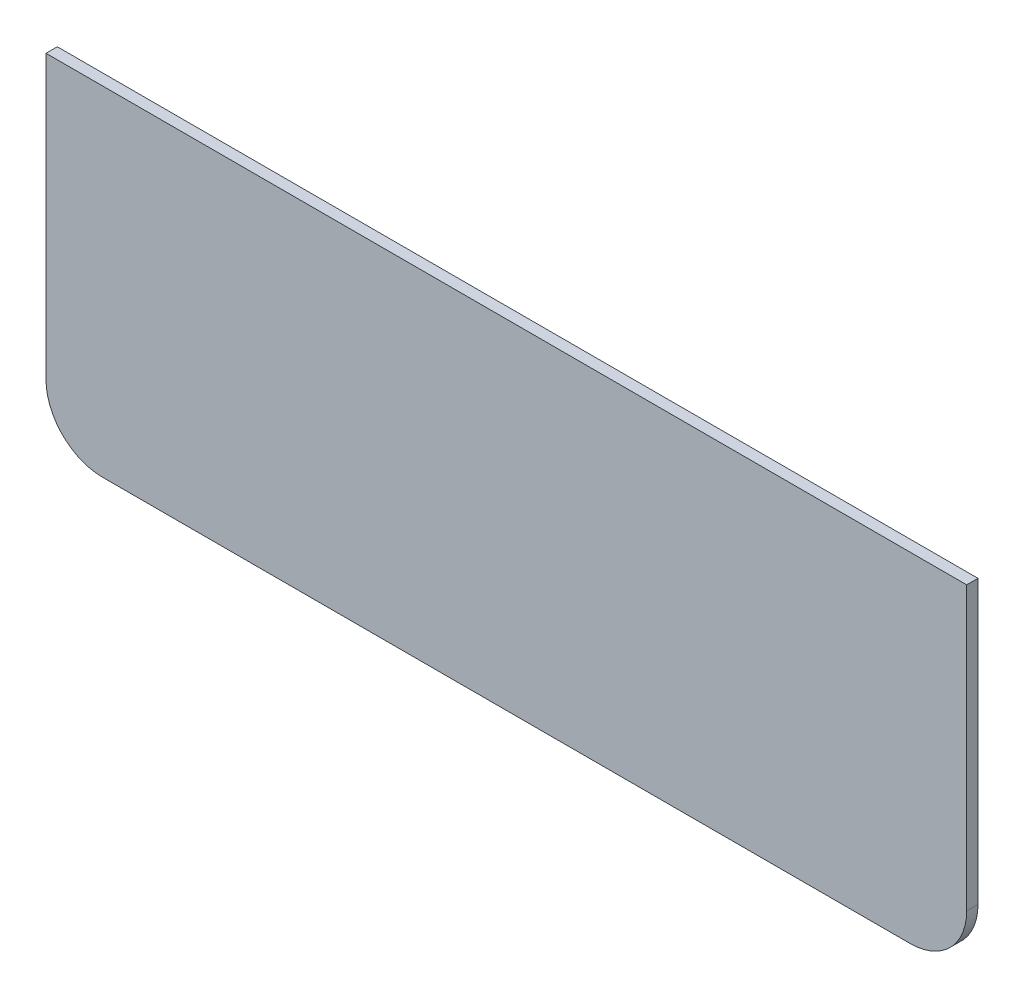
ISO-10303-21;
HEADER;
FILE_DESCRIPTION(('STEP AP214'),'2;1');
FILE_NAME('part.step','',(''),(''),'','','');
FILE_SCHEMA(('AUTOMOTIVE_DESIGN { 1 0 10303 214 1 1 1 1 }'));
ENDSEC;
DATA;
#1=APPLICATION_CONTEXT('core data for automotive mechanical design processes');
#2=APPLICATION_PROTOCOL_DEFINITION('international standard','automotive_design',2000,#1);
#3=PRODUCT_CONTEXT('',#1,'mechanical');
#4=PRODUCT('Part','Part','',(#3));
#5=PRODUCT_RELATED_PRODUCT_CATEGORY('part','',(#4));
#6=PRODUCT_DEFINITION_FORMATION('','',#4);
#7=PRODUCT_DEFINITION_CONTEXT('part definition',#1,'design');
#8=PRODUCT_DEFINITION('design','',#6,#7);
#9=PRODUCT_DEFINITION_SHAPE('','',#8);
#10=(LENGTH_UNIT() NAMED_UNIT(*) SI_UNIT(.MILLI.,.METRE.));
#11=(NAMED_UNIT(*) PLANE_ANGLE_UNIT() SI_UNIT($,.RADIAN.));
#12=(NAMED_UNIT(*) SI_UNIT($,.STERADIAN.) SOLID_ANGLE_UNIT());
#13=UNCERTAINTY_MEASURE_WITH_UNIT(LENGTH_MEASURE(1.E-05),#10,'distance_accuracy_value','');
#14=(GEOMETRIC_REPRESENTATION_CONTEXT(3) GLOBAL_UNCERTAINTY_ASSIGNED_CONTEXT((#13)) GLOBAL_UNIT_ASSIGNED_CONTEXT((#10,
#11,#12)) REPRESENTATION_CONTEXT('',''));
#15=CARTESIAN_POINT('',(0.,0.,0.));
#16=DIRECTION('',(0.,0.,1.));
#17=DIRECTION('',(1.,0.,0.));
#18=AXIS2_PLACEMENT_3D('',#15,#16,#17);
#19=CARTESIAN_POINT('',(81.5,-30.,2.));
#20=DIRECTION('',(-1.,0.,0.));
#21=DIRECTION('',(0.,0.,1.));
#22=AXIS2_PLACEMENT_3D('',#19,#20,#21);
#23=PLANE('',#22);
#24=DIRECTION('',(0.,1.,0.));
#25=VECTOR('',#24,1.);
#26=CARTESIAN_POINT('',(81.5,-30.,2.));
#27=LINE('',#26,#25);
#28=CARTESIAN_POINT('',(81.5,-20.,2.));
#29=VERTEX_POINT('',#28);
#30=CARTESIAN_POINT('',(81.5,30.,2.));
#31=VERTEX_POINT('',#30);
#32=EDGE_CURVE('E95',#29,#31,#27,.T.);
#33=ORIENTED_EDGE('',*,*,#32,.F.);
#34=DIRECTION('',(0.,0.,-1.));
#35=VECTOR('',#34,1.);
#36=CARTESIAN_POINT('',(81.5,-20.,2.));
#37=LINE('',#36,#35);
#38=CARTESIAN_POINT('',(81.5,-20.,0.));
#39=VERTEX_POINT('',#38);
#40=EDGE_CURVE('E118',#29,#39,#37,.T.);
#41=ORIENTED_EDGE('',*,*,#40,.T.);
#42=DIRECTION('',(0.,1.,0.));
#43=VECTOR('',#42,1.);
#44=CARTESIAN_POINT('',(81.5,-30.,0.));
#45=LINE('',#44,#43);
#46=CARTESIAN_POINT('',(81.5,30.,0.));
#47=VERTEX_POINT('',#46);
#48=EDGE_CURVE('E116',#39,#47,#45,.T.);
#49=ORIENTED_EDGE('',*,*,#48,.T.);
#50=DIRECTION('',(0.,0.,-1.));
#51=VECTOR('',#50,1.);
#52=CARTESIAN_POINT('',(81.5,30.,2.));
#53=LINE('',#52,#51);
#54=EDGE_CURVE('E110',#31,#47,#53,.T.);
#55=ORIENTED_EDGE('',*,*,#54,.F.);
#56=EDGE_LOOP('',(#33,#41,#49,#55));
#57=FACE_BOUND('',#56,.T.);
#58=ADVANCED_FACE('F41',(#57),#23,.F.);
#59=CARTESIAN_POINT('',(-81.5,30.,2.));
#60=DIRECTION('',(0.,-1.,0.));
#61=DIRECTION('',(0.,0.,-1.));
#62=AXIS2_PLACEMENT_3D('',#59,#60,#61);
#63=PLANE('',#62);
#64=DIRECTION('',(-1.,0.,0.));
#65=VECTOR('',#64,1.);
#66=CARTESIAN_POINT('',(-81.5,30.,0.));
#67=LINE('',#66,#65);
#68=CARTESIAN_POINT('',(-81.5,30.,0.));
#69=VERTEX_POINT('',#68);
#70=EDGE_CURVE('E145',#47,#69,#67,.T.);
#71=ORIENTED_EDGE('',*,*,#70,.T.);
#72=DIRECTION('',(0.,0.,-1.));
#73=VECTOR('',#72,1.);
#74=CARTESIAN_POINT('',(-81.5,30.,2.));
#75=LINE('',#74,#73);
#76=CARTESIAN_POINT('',(-81.5,30.,2.));
#77=VERTEX_POINT('',#76);
#78=EDGE_CURVE('E112',#77,#69,#75,.T.);
#79=ORIENTED_EDGE('',*,*,#78,.F.);
#80=DIRECTION('',(-1.,0.,0.));
#81=VECTOR('',#80,1.);
#82=CARTESIAN_POINT('',(-81.5,30.,2.));
#83=LINE('',#82,#81);
#84=EDGE_CURVE('E98',#31,#77,#83,.T.);
#85=ORIENTED_EDGE('',*,*,#84,.F.);
#86=ORIENTED_EDGE('',*,*,#54,.T.);
#87=EDGE_LOOP('',(#71,#79,#85,#86));
#88=FACE_BOUND('',#87,.T.);
#89=ADVANCED_FACE('F109',(#88),#63,.F.);
#90=CARTESIAN_POINT('',(-81.5,-30.,2.));
#91=DIRECTION('',(1.,0.,0.));
#92=DIRECTION('',(0.,0.,-1.));
#93=AXIS2_PLACEMENT_3D('',#90,#91,#92);
#94=PLANE('',#93);
#95=DIRECTION('',(0.,-1.,0.));
#96=VECTOR('',#95,1.);
#97=CARTESIAN_POINT('',(-81.5,-30.,0.));
#98=LINE('',#97,#96);
#99=CARTESIAN_POINT('',(-81.5,-20.,0.));
#100=VERTEX_POINT('',#99);
#101=EDGE_CURVE('E143',#69,#100,#98,.T.);
#102=ORIENTED_EDGE('',*,*,#101,.T.);
#103=DIRECTION('',(0.,0.,-1.));
#104=VECTOR('',#103,1.);
#105=CARTESIAN_POINT('',(-81.5,-20.,2.));
#106=LINE('',#105,#104);
#107=CARTESIAN_POINT('',(-81.5,-20.,2.));
#108=VERTEX_POINT('',#107);
#109=EDGE_CURVE('E11',#100,#108,#106,.F.);
#110=ORIENTED_EDGE('',*,*,#109,.T.);
#111=DIRECTION('',(0.,-1.,0.));
#112=VECTOR('',#111,1.);
#113=CARTESIAN_POINT('',(-81.5,-30.,2.));
#114=LINE('',#113,#112);
#115=EDGE_CURVE('E113',#77,#108,#114,.T.);
#116=ORIENTED_EDGE('',*,*,#115,.F.);
#117=ORIENTED_EDGE('',*,*,#78,.T.);
#118=EDGE_LOOP('',(#102,#110,#116,#117));
#119=FACE_BOUND('',#118,.T.);
#120=ADVANCED_FACE('F144',(#119),#94,.F.);
#121=CARTESIAN_POINT('',(-81.5,-30.,2.));
#122=DIRECTION('',(0.,1.,0.));
#123=DIRECTION('',(0.,0.,1.));
#124=AXIS2_PLACEMENT_3D('',#121,#122,#123);
#125=PLANE('',#124);
#126=DIRECTION('',(1.,0.,0.));
#127=VECTOR('',#126,1.);
#128=CARTESIAN_POINT('',(-81.5,-30.,0.));
#129=LINE('',#128,#127);
#130=CARTESIAN_POINT('',(-71.5,-30.,0.));
#131=VERTEX_POINT('',#130);
#132=CARTESIAN_POINT('',(71.5,-30.,0.));
#133=VERTEX_POINT('',#132);
#134=EDGE_CURVE('E105',#131,#133,#129,.T.);
#135=ORIENTED_EDGE('',*,*,#134,.T.);
#136=DIRECTION('',(0.,0.,-1.));
#137=VECTOR('',#136,1.);
#138=CARTESIAN_POINT('',(71.5,-30.,2.));
#139=LINE('',#138,#137);
#140=CARTESIAN_POINT('',(71.5,-30.,2.));
#141=VERTEX_POINT('',#140);
#142=EDGE_CURVE('E62',#133,#141,#139,.F.);
#143=ORIENTED_EDGE('',*,*,#142,.T.);
#144=DIRECTION('',(1.,0.,0.));
#145=VECTOR('',#144,1.);
#146=CARTESIAN_POINT('',(-81.5,-30.,2.));
#147=LINE('',#146,#145);
#148=CARTESIAN_POINT('',(-71.5,-30.,2.));
#149=VERTEX_POINT('',#148);
#150=EDGE_CURVE('E122',#149,#141,#147,.T.);
#151=ORIENTED_EDGE('',*,*,#150,.F.);
#152=DIRECTION('',(0.,0.,-1.));
#153=VECTOR('',#152,1.);
#154=CARTESIAN_POINT('',(-71.5,-30.,2.));
#155=LINE('',#154,#153);
#156=EDGE_CURVE('E129',#149,#131,#155,.T.);
#157=ORIENTED_EDGE('',*,*,#156,.T.);
#158=EDGE_LOOP('',(#135,#143,#151,#157));
#159=FACE_BOUND('',#158,.T.);
#160=ADVANCED_FACE('F137',(#159),#125,.F.);
#161=CARTESIAN_POINT('',(0.,0.,2.));
#162=DIRECTION('',(0.,0.,-1.));
#163=DIRECTION('',(-1.,0.,0.));
#164=AXIS2_PLACEMENT_3D('',#161,#162,#163);
#165=PLANE('',#164);
#166=ORIENTED_EDGE('',*,*,#150,.T.);
#167=CARTESIAN_POINT('',(71.5,-20.,2.));
#168=DIRECTION('',(0.,0.,-1.));
#169=DIRECTION('',(-1.,0.,0.));
#170=AXIS2_PLACEMENT_3D('',#167,#168,#169);
#171=CIRCLE('',#170,10.);
#172=EDGE_CURVE('E49',#141,#29,#171,.F.);
#173=ORIENTED_EDGE('',*,*,#172,.T.);
#174=ORIENTED_EDGE('',*,*,#32,.T.);
#175=ORIENTED_EDGE('',*,*,#84,.T.);
#176=ORIENTED_EDGE('',*,*,#115,.T.);
#177=CARTESIAN_POINT('',(-71.5,-20.,2.));
#178=DIRECTION('',(0.,0.,-1.));
#179=DIRECTION('',(-1.,0.,0.));
#180=AXIS2_PLACEMENT_3D('',#177,#178,#179);
#181=CIRCLE('',#180,10.);
#182=EDGE_CURVE('E133',#108,#149,#181,.F.);
#183=ORIENTED_EDGE('',*,*,#182,.T.);
#184=EDGE_LOOP('',(#166,#173,#174,#175,#176,#183));
#185=FACE_BOUND('',#184,.T.);
#186=ADVANCED_FACE('F97',(#185),#165,.F.);
#187=CARTESIAN_POINT('',(0.,0.,0.));
#188=DIRECTION('',(0.,0.,-1.));
#189=DIRECTION('',(-1.,0.,0.));
#190=AXIS2_PLACEMENT_3D('',#187,#188,#189);
#191=PLANE('',#190);
#192=ORIENTED_EDGE('',*,*,#48,.F.);
#193=CARTESIAN_POINT('',(71.5,-20.,0.));
#194=DIRECTION('',(0.,0.,-1.));
#195=DIRECTION('',(-1.,0.,0.));
#196=AXIS2_PLACEMENT_3D('',#193,#194,#195);
#197=CIRCLE('',#196,10.);
#198=EDGE_CURVE('E127',#39,#133,#197,.T.);
#199=ORIENTED_EDGE('',*,*,#198,.T.);
#200=ORIENTED_EDGE('',*,*,#134,.F.);
#201=CARTESIAN_POINT('',(-71.5,-20.,0.));
#202=DIRECTION('',(0.,0.,-1.));
#203=DIRECTION('',(-1.,0.,0.));
#204=AXIS2_PLACEMENT_3D('',#201,#202,#203);
#205=CIRCLE('',#204,10.);
#206=EDGE_CURVE('E120',#131,#100,#205,.T.);
#207=ORIENTED_EDGE('',*,*,#206,.T.);
#208=ORIENTED_EDGE('',*,*,#101,.F.);
#209=ORIENTED_EDGE('',*,*,#70,.F.);
#210=EDGE_LOOP('',(#192,#199,#200,#207,#208,#209));
#211=FACE_BOUND('',#210,.T.);
#212=ADVANCED_FACE('F142',(#211),#191,.T.);
#213=CARTESIAN_POINT('',(71.5,-20.,2.));
#214=DIRECTION('',(0.,0.,-1.));
#215=DIRECTION('',(-1.,0.,0.));
#216=AXIS2_PLACEMENT_3D('',#213,#214,#215);
#217=CYLINDRICAL_SURFACE('',#216,10.);
#218=ORIENTED_EDGE('',*,*,#172,.F.);
#219=ORIENTED_EDGE('',*,*,#142,.F.);
#220=ORIENTED_EDGE('',*,*,#198,.F.);
#221=ORIENTED_EDGE('',*,*,#40,.F.);
#222=EDGE_LOOP('',(#218,#219,#220,#221));
#223=FACE_BOUND('',#222,.T.);
#224=ADVANCED_FACE('F151',(#223),#217,.T.);
#225=CARTESIAN_POINT('',(-71.5,-20.,2.));
#226=DIRECTION('',(0.,0.,-1.));
#227=DIRECTION('',(-1.,0.,0.));
#228=AXIS2_PLACEMENT_3D('',#225,#226,#227);
#229=CYLINDRICAL_SURFACE('',#228,10.);
#230=ORIENTED_EDGE('',*,*,#182,.F.);
#231=ORIENTED_EDGE('',*,*,#109,.F.);
#232=ORIENTED_EDGE('',*,*,#206,.F.);
#233=ORIENTED_EDGE('',*,*,#156,.F.);
#234=EDGE_LOOP('',(#230,#231,#232,#233));
#235=FACE_BOUND('',#234,.T.);
#236=ADVANCED_FACE('F43',(#235),#229,.T.);
#237=CLOSED_SHELL('',(#58,#89,#120,#160,#186,#212,#224,#236));
#238=MANIFOLD_SOLID_BREP('B2',#237);
#239=ADVANCED_BREP_SHAPE_REPRESENTATION('',(#18,#238),#14);
#240=SHAPE_DEFINITION_REPRESENTATION(#9,#239);
ENDSEC;
END-ISO-10303-21;
